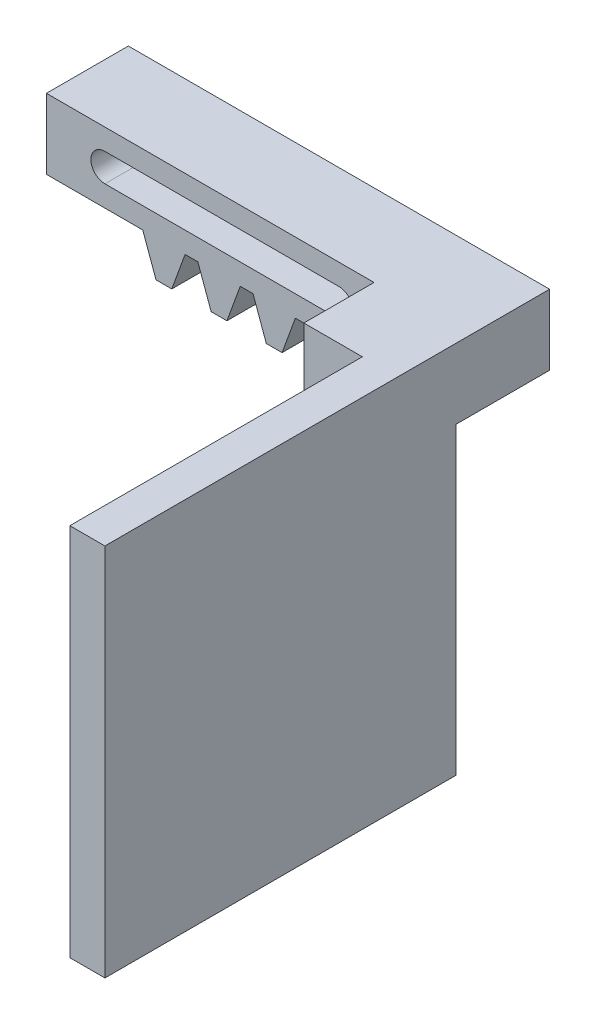
ISO-10303-21;
HEADER;
FILE_DESCRIPTION(('STEP AP214'),'2;1');
FILE_NAME('part.step','',(''),(''),'','','');
FILE_SCHEMA(('AUTOMOTIVE_DESIGN { 1 0 10303 214 1 1 1 1 }'));
ENDSEC;
DATA;
#1=APPLICATION_CONTEXT('core data for automotive mechanical design processes');
#2=APPLICATION_PROTOCOL_DEFINITION('international standard','automotive_design',2000,#1);
#3=PRODUCT_CONTEXT('',#1,'mechanical');
#4=PRODUCT('Part','Part','',(#3));
#5=PRODUCT_RELATED_PRODUCT_CATEGORY('part','',(#4));
#6=PRODUCT_DEFINITION_FORMATION('','',#4);
#7=PRODUCT_DEFINITION_CONTEXT('part definition',#1,'design');
#8=PRODUCT_DEFINITION('design','',#6,#7);
#9=PRODUCT_DEFINITION_SHAPE('','',#8);
#10=(LENGTH_UNIT() NAMED_UNIT(*) SI_UNIT(.MILLI.,.METRE.));
#11=(NAMED_UNIT(*) PLANE_ANGLE_UNIT() SI_UNIT($,.RADIAN.));
#12=(NAMED_UNIT(*) SI_UNIT($,.STERADIAN.) SOLID_ANGLE_UNIT());
#13=UNCERTAINTY_MEASURE_WITH_UNIT(LENGTH_MEASURE(1.E-05),#10,'distance_accuracy_value','');
#14=(GEOMETRIC_REPRESENTATION_CONTEXT(3) GLOBAL_UNCERTAINTY_ASSIGNED_CONTEXT((#13)) GLOBAL_UNIT_ASSIGNED_CONTEXT((#10,
#11,#12)) REPRESENTATION_CONTEXT('',''));
#15=CARTESIAN_POINT('',(0.,0.,0.));
#16=DIRECTION('',(0.,0.,1.));
#17=DIRECTION('',(1.,0.,0.));
#18=AXIS2_PLACEMENT_3D('',#15,#16,#17);
#19=CARTESIAN_POINT('',(0.,0.,20.5));
#20=DIRECTION('',(0.,0.,-1.));
#21=DIRECTION('',(-1.,0.,0.));
#22=AXIS2_PLACEMENT_3D('',#19,#20,#21);
#23=PLANE('',#22);
#24=CARTESIAN_POINT('',(-18.,16.975,20.5));
#25=DIRECTION('',(0.,0.,-1.));
#26=DIRECTION('',(-1.,0.,0.));
#27=AXIS2_PLACEMENT_3D('',#24,#25,#26);
#28=CIRCLE('',#27,1.2);
#29=CARTESIAN_POINT('',(-18.,18.175,20.5));
#30=VERTEX_POINT('',#29);
#31=CARTESIAN_POINT('',(-18.,15.775,20.5));
#32=VERTEX_POINT('',#31);
#33=EDGE_CURVE('E502',#30,#32,#28,.F.);
#34=ORIENTED_EDGE('',*,*,#33,.F.);
#35=DIRECTION('',(-1.,0.,0.));
#36=VECTOR('',#35,1.);
#37=CARTESIAN_POINT('',(0.,18.175,20.5));
#38=LINE('',#37,#36);
#39=CARTESIAN_POINT('',(2.,18.175,20.5));
#40=VERTEX_POINT('',#39);
#41=EDGE_CURVE('E500',#40,#30,#38,.T.);
#42=ORIENTED_EDGE('',*,*,#41,.F.);
#43=CARTESIAN_POINT('',(2.,16.975,20.5));
#44=DIRECTION('',(0.,0.,-1.));
#45=DIRECTION('',(-1.,0.,0.));
#46=AXIS2_PLACEMENT_3D('',#43,#44,#45);
#47=CIRCLE('',#46,1.2);
#48=CARTESIAN_POINT('',(2.,15.775,20.5));
#49=VERTEX_POINT('',#48);
#50=EDGE_CURVE('E53',#49,#40,#47,.F.);
#51=ORIENTED_EDGE('',*,*,#50,.F.);
#52=DIRECTION('',(1.,0.,0.));
#53=VECTOR('',#52,1.);
#54=CARTESIAN_POINT('',(0.,15.775,20.5));
#55=LINE('',#54,#53);
#56=EDGE_CURVE('E486',#32,#49,#55,.T.);
#57=ORIENTED_EDGE('',*,*,#56,.F.);
#58=EDGE_LOOP('',(#34,#42,#51,#57));
#59=FACE_BOUND('',#58,.T.);
#60=DIRECTION('',(0.,-1.,0.));
#61=VECTOR('',#60,1.);
#62=CARTESIAN_POINT('',(5.,19.975,20.5));
#63=LINE('',#62,#61);
#64=CARTESIAN_POINT('',(5.,19.975,20.5));
#65=VERTEX_POINT('',#64);
#66=CARTESIAN_POINT('',(5.,13.975,20.5));
#67=VERTEX_POINT('',#66);
#68=EDGE_CURVE('E456',#65,#67,#63,.T.);
#69=ORIENTED_EDGE('',*,*,#68,.F.);
#70=DIRECTION('',(-1.,0.,0.));
#71=VECTOR('',#70,1.);
#72=CARTESIAN_POINT('',(-23.,19.975,20.5));
#73=LINE('',#72,#71);
#74=CARTESIAN_POINT('',(-23.,19.975,20.5));
#75=VERTEX_POINT('',#74);
#76=EDGE_CURVE('E353',#65,#75,#73,.T.);
#77=ORIENTED_EDGE('',*,*,#76,.T.);
#78=DIRECTION('',(0.,-1.,0.));
#79=VECTOR('',#78,1.);
#80=CARTESIAN_POINT('',(-23.,13.975,20.5));
#81=LINE('',#80,#79);
#82=CARTESIAN_POINT('',(-23.,13.975,20.5));
#83=VERTEX_POINT('',#82);
#84=EDGE_CURVE('E355',#75,#83,#81,.T.);
#85=ORIENTED_EDGE('',*,*,#84,.T.);
#86=DIRECTION('',(1.,0.,0.));
#87=VECTOR('',#86,1.);
#88=CARTESIAN_POINT('',(-14.7696111304032,13.975,20.5));
#89=LINE('',#88,#87);
#90=CARTESIAN_POINT('',(-14.7696111304032,13.975,20.5));
#91=VERTEX_POINT('',#90);
#92=EDGE_CURVE('E441',#83,#91,#89,.T.);
#93=ORIENTED_EDGE('',*,*,#92,.T.);
#94=DIRECTION('',(0.342020143325669,-0.939692620785908,0.));
#95=VECTOR('',#94,1.);
#96=CARTESIAN_POINT('',(-13.6322041483213,10.85,20.5));
#97=LINE('',#96,#95);
#98=CARTESIAN_POINT('',(-13.6322041483213,10.85,20.5));
#99=VERTEX_POINT('',#98);
#100=EDGE_CURVE('E445',#91,#99,#97,.T.);
#101=ORIENTED_EDGE('',*,*,#100,.T.);
#102=DIRECTION('',(1.,0.,0.));
#103=VECTOR('',#102,1.);
#104=CARTESIAN_POINT('',(-12.2859352437945,10.85,20.5));
#105=LINE('',#104,#103);
#106=CARTESIAN_POINT('',(-12.2859352437945,10.85,20.5));
#107=VERTEX_POINT('',#106);
#108=EDGE_CURVE('E439',#99,#107,#105,.T.);
#109=ORIENTED_EDGE('',*,*,#108,.T.);
#110=DIRECTION('',(0.342020143325669,0.939692620785908,0.));
#111=VECTOR('',#110,1.);
#112=CARTESIAN_POINT('',(-11.1485282617126,13.975,20.5));
#113=LINE('',#112,#111);
#114=CARTESIAN_POINT('',(-11.1485282617126,13.975,20.5));
#115=VERTEX_POINT('',#114);
#116=EDGE_CURVE('E437',#107,#115,#113,.T.);
#117=ORIENTED_EDGE('',*,*,#116,.T.);
#118=DIRECTION('',(1.,0.,0.));
#119=VECTOR('',#118,1.);
#120=CARTESIAN_POINT('',(-10.0572221500185,13.975,20.5));
#121=LINE('',#120,#119);
#122=CARTESIAN_POINT('',(-10.0572221500185,13.975,20.5));
#123=VERTEX_POINT('',#122);
#124=EDGE_CURVE('E436',#115,#123,#121,.T.);
#125=ORIENTED_EDGE('',*,*,#124,.T.);
#126=DIRECTION('',(0.342020143325669,-0.939692620785908,0.));
#127=VECTOR('',#126,1.);
#128=CARTESIAN_POINT('',(-8.91981516793663,10.85,20.5));
#129=LINE('',#128,#127);
#130=CARTESIAN_POINT('',(-8.91981516793663,10.85,20.5));
#131=VERTEX_POINT('',#130);
#132=EDGE_CURVE('E432',#123,#131,#129,.T.);
#133=ORIENTED_EDGE('',*,*,#132,.T.);
#134=DIRECTION('',(1.,0.,0.));
#135=VECTOR('',#134,1.);
#136=CARTESIAN_POINT('',(-7.57354626340979,10.85,20.5));
#137=LINE('',#136,#135);
#138=CARTESIAN_POINT('',(-7.57354626340979,10.85,20.5));
#139=VERTEX_POINT('',#138);
#140=EDGE_CURVE('E435',#131,#139,#137,.T.);
#141=ORIENTED_EDGE('',*,*,#140,.T.);
#142=DIRECTION('',(0.342020143325669,0.939692620785909,0.));
#143=VECTOR('',#142,1.);
#144=CARTESIAN_POINT('',(-6.43613928132791,13.975,20.5));
#145=LINE('',#144,#143);
#146=CARTESIAN_POINT('',(-6.43613928132791,13.975,20.5));
#147=VERTEX_POINT('',#146);
#148=EDGE_CURVE('E429',#139,#147,#145,.T.);
#149=ORIENTED_EDGE('',*,*,#148,.T.);
#150=DIRECTION('',(1.,0.,0.));
#151=VECTOR('',#150,1.);
#152=CARTESIAN_POINT('',(-5.34483316963382,13.975,20.5));
#153=LINE('',#152,#151);
#154=CARTESIAN_POINT('',(-5.34483316963382,13.975,20.5));
#155=VERTEX_POINT('',#154);
#156=EDGE_CURVE('E428',#147,#155,#153,.T.);
#157=ORIENTED_EDGE('',*,*,#156,.T.);
#158=DIRECTION('',(0.342020143325669,-0.939692620785909,0.));
#159=VECTOR('',#158,1.);
#160=CARTESIAN_POINT('',(-4.20742618755194,10.85,20.5));
#161=LINE('',#160,#159);
#162=CARTESIAN_POINT('',(-4.20742618755194,10.85,20.5));
#163=VERTEX_POINT('',#162);
#164=EDGE_CURVE('E426',#155,#163,#161,.T.);
#165=ORIENTED_EDGE('',*,*,#164,.T.);
#166=DIRECTION('',(1.,0.,0.));
#167=VECTOR('',#166,1.);
#168=CARTESIAN_POINT('',(-2.8611572830251,10.85,20.5));
#169=LINE('',#168,#167);
#170=CARTESIAN_POINT('',(-2.8611572830251,10.85,20.5));
#171=VERTEX_POINT('',#170);
#172=EDGE_CURVE('E424',#163,#171,#169,.T.);
#173=ORIENTED_EDGE('',*,*,#172,.T.);
#174=DIRECTION('',(0.342020143325669,0.939692620785909,0.));
#175=VECTOR('',#174,1.);
#176=CARTESIAN_POINT('',(-1.72375030094322,13.975,20.5));
#177=LINE('',#176,#175);
#178=CARTESIAN_POINT('',(-1.72375030094322,13.975,20.5));
#179=VERTEX_POINT('',#178);
#180=EDGE_CURVE('E425',#171,#179,#177,.T.);
#181=ORIENTED_EDGE('',*,*,#180,.T.);
#182=DIRECTION('',(1.,0.,0.));
#183=VECTOR('',#182,1.);
#184=CARTESIAN_POINT('',(-0.632444189249129,13.975,20.5));
#185=LINE('',#184,#183);
#186=CARTESIAN_POINT('',(-0.632444189249129,13.975,20.5));
#187=VERTEX_POINT('',#186);
#188=EDGE_CURVE('E419',#179,#187,#185,.T.);
#189=ORIENTED_EDGE('',*,*,#188,.T.);
#190=DIRECTION('',(0.342020143325669,-0.939692620785909,0.));
#191=VECTOR('',#190,1.);
#192=CARTESIAN_POINT('',(0.504962792832753,10.85,20.5));
#193=LINE('',#192,#191);
#194=CARTESIAN_POINT('',(0.504962792832753,10.85,20.5));
#195=VERTEX_POINT('',#194);
#196=EDGE_CURVE('E416',#187,#195,#193,.T.);
#197=ORIENTED_EDGE('',*,*,#196,.T.);
#198=DIRECTION('',(1.,0.,0.));
#199=VECTOR('',#198,1.);
#200=CARTESIAN_POINT('',(1.85123169735959,10.85,20.5));
#201=LINE('',#200,#199);
#202=CARTESIAN_POINT('',(1.85123169735959,10.85,20.5));
#203=VERTEX_POINT('',#202);
#204=EDGE_CURVE('E418',#195,#203,#201,.T.);
#205=ORIENTED_EDGE('',*,*,#204,.T.);
#206=DIRECTION('',(0.342020143325669,0.939692620785909,0.));
#207=VECTOR('',#206,1.);
#208=CARTESIAN_POINT('',(2.98863867944147,13.975,20.5));
#209=LINE('',#208,#207);
#210=CARTESIAN_POINT('',(2.98863867944147,13.975,20.5));
#211=VERTEX_POINT('',#210);
#212=EDGE_CURVE('E412',#203,#211,#209,.T.);
#213=ORIENTED_EDGE('',*,*,#212,.T.);
#214=DIRECTION('',(1.,0.,0.));
#215=VECTOR('',#214,1.);
#216=CARTESIAN_POINT('',(4.07994479113556,13.975,20.5));
#217=LINE('',#216,#215);
#218=CARTESIAN_POINT('',(4.07994479113556,13.975,20.5));
#219=VERTEX_POINT('',#218);
#220=EDGE_CURVE('E415',#211,#219,#217,.T.);
#221=ORIENTED_EDGE('',*,*,#220,.T.);
#222=DIRECTION('',(0.342020143325669,-0.939692620785909,0.));
#223=VECTOR('',#222,1.);
#224=CARTESIAN_POINT('',(5.21735177321744,10.85,20.5));
#225=LINE('',#224,#223);
#226=CARTESIAN_POINT('',(5.21735177321744,10.85,20.5));
#227=VERTEX_POINT('',#226);
#228=EDGE_CURVE('E406',#219,#227,#225,.T.);
#229=ORIENTED_EDGE('',*,*,#228,.T.);
#230=DIRECTION('',(1.,0.,0.));
#231=VECTOR('',#230,1.);
#232=CARTESIAN_POINT('',(6.56362067774428,10.85,20.5));
#233=LINE('',#232,#231);
#234=CARTESIAN_POINT('',(6.56362067774428,10.85,20.5));
#235=VERTEX_POINT('',#234);
#236=EDGE_CURVE('E407',#227,#235,#233,.T.);
#237=ORIENTED_EDGE('',*,*,#236,.T.);
#238=DIRECTION('',(0.342020143325669,0.939692620785909,0.));
#239=VECTOR('',#238,1.);
#240=CARTESIAN_POINT('',(7.70102765982616,13.975,20.5));
#241=LINE('',#240,#239);
#242=CARTESIAN_POINT('',(7.70102765982616,13.975,20.5));
#243=VERTEX_POINT('',#242);
#244=EDGE_CURVE('E408',#235,#243,#241,.T.);
#245=ORIENTED_EDGE('',*,*,#244,.T.);
#246=DIRECTION('',(1.,0.,0.));
#247=VECTOR('',#246,1.);
#248=CARTESIAN_POINT('',(5.,13.975,20.5));
#249=LINE('',#248,#247);
#250=EDGE_CURVE('E452',#67,#243,#249,.T.);
#251=ORIENTED_EDGE('',*,*,#250,.F.);
#252=EDGE_LOOP('',(#69,#77,#85,#93,#101,#109,#117,#125,#133,#141,#149,#157,#165,#173,#181,#189,
#197,#205,#213,#221,#229,#237,#245,#251));
#253=FACE_BOUND('',#252,.T.);
#254=ADVANCED_FACE('F39',(#59,#253),#23,.F.);
#255=CARTESIAN_POINT('',(0.,0.,13.5));
#256=DIRECTION('',(0.,0.,-1.));
#257=DIRECTION('',(-1.,0.,0.));
#258=AXIS2_PLACEMENT_3D('',#255,#256,#257);
#259=PLANE('',#258);
#260=DIRECTION('',(0.,-1.,0.));
#261=VECTOR('',#260,1.);
#262=CARTESIAN_POINT('',(-23.,13.975,13.5));
#263=LINE('',#262,#261);
#264=CARTESIAN_POINT('',(-23.,19.975,13.5));
#265=VERTEX_POINT('',#264);
#266=CARTESIAN_POINT('',(-23.,13.975,13.5));
#267=VERTEX_POINT('',#266);
#268=EDGE_CURVE('E402',#265,#267,#263,.T.);
#269=ORIENTED_EDGE('',*,*,#268,.F.);
#270=DIRECTION('',(-1.,0.,0.));
#271=VECTOR('',#270,1.);
#272=CARTESIAN_POINT('',(-23.,19.975,13.5));
#273=LINE('',#272,#271);
#274=CARTESIAN_POINT('',(13.,19.975,13.5));
#275=VERTEX_POINT('',#274);
#276=EDGE_CURVE('E354',#275,#265,#273,.T.);
#277=ORIENTED_EDGE('',*,*,#276,.F.);
#278=DIRECTION('',(0.,1.,0.));
#279=VECTOR('',#278,1.);
#280=CARTESIAN_POINT('',(13.,19.975,13.5));
#281=LINE('',#280,#279);
#282=CARTESIAN_POINT('',(13.,13.975,13.5));
#283=VERTEX_POINT('',#282);
#284=EDGE_CURVE('E351',#283,#275,#281,.T.);
#285=ORIENTED_EDGE('',*,*,#284,.F.);
#286=DIRECTION('',(1.,0.,0.));
#287=VECTOR('',#286,1.);
#288=CARTESIAN_POINT('',(13.,13.975,13.5));
#289=LINE('',#288,#287);
#290=CARTESIAN_POINT('',(7.70102765982616,13.975,13.5));
#291=VERTEX_POINT('',#290);
#292=EDGE_CURVE('E356',#291,#283,#289,.T.);
#293=ORIENTED_EDGE('',*,*,#292,.F.);
#294=DIRECTION('',(0.342020143325669,0.939692620785909,0.));
#295=VECTOR('',#294,1.);
#296=CARTESIAN_POINT('',(7.70102765982616,13.975,13.5));
#297=LINE('',#296,#295);
#298=CARTESIAN_POINT('',(6.56362067774428,10.85,13.5));
#299=VERTEX_POINT('',#298);
#300=EDGE_CURVE('E363',#299,#291,#297,.T.);
#301=ORIENTED_EDGE('',*,*,#300,.F.);
#302=DIRECTION('',(1.,0.,0.));
#303=VECTOR('',#302,1.);
#304=CARTESIAN_POINT('',(6.56362067774428,10.85,13.5));
#305=LINE('',#304,#303);
#306=CARTESIAN_POINT('',(5.21735177321744,10.85,13.5));
#307=VERTEX_POINT('',#306);
#308=EDGE_CURVE('E361',#307,#299,#305,.T.);
#309=ORIENTED_EDGE('',*,*,#308,.F.);
#310=DIRECTION('',(0.342020143325669,-0.939692620785909,0.));
#311=VECTOR('',#310,1.);
#312=CARTESIAN_POINT('',(5.21735177321744,10.85,13.5));
#313=LINE('',#312,#311);
#314=CARTESIAN_POINT('',(4.07994479113556,13.975,13.5));
#315=VERTEX_POINT('',#314);
#316=EDGE_CURVE('E364',#315,#307,#313,.T.);
#317=ORIENTED_EDGE('',*,*,#316,.F.);
#318=DIRECTION('',(1.,0.,0.));
#319=VECTOR('',#318,1.);
#320=CARTESIAN_POINT('',(4.07994479113556,13.975,13.5));
#321=LINE('',#320,#319);
#322=CARTESIAN_POINT('',(2.98863867944147,13.975,13.5));
#323=VERTEX_POINT('',#322);
#324=EDGE_CURVE('E370',#323,#315,#321,.T.);
#325=ORIENTED_EDGE('',*,*,#324,.F.);
#326=DIRECTION('',(0.342020143325669,0.939692620785909,0.));
#327=VECTOR('',#326,1.);
#328=CARTESIAN_POINT('',(2.98863867944147,13.975,13.5));
#329=LINE('',#328,#327);
#330=CARTESIAN_POINT('',(1.85123169735959,10.85,13.5));
#331=VERTEX_POINT('',#330);
#332=EDGE_CURVE('E369',#331,#323,#329,.T.);
#333=ORIENTED_EDGE('',*,*,#332,.F.);
#334=DIRECTION('',(1.,0.,0.));
#335=VECTOR('',#334,1.);
#336=CARTESIAN_POINT('',(1.85123169735959,10.85,13.5));
#337=LINE('',#336,#335);
#338=CARTESIAN_POINT('',(0.504962792832753,10.85,13.5));
#339=VERTEX_POINT('',#338);
#340=EDGE_CURVE('E371',#339,#331,#337,.T.);
#341=ORIENTED_EDGE('',*,*,#340,.F.);
#342=DIRECTION('',(0.342020143325669,-0.939692620785909,0.));
#343=VECTOR('',#342,1.);
#344=CARTESIAN_POINT('',(0.504962792832753,10.85,13.5));
#345=LINE('',#344,#343);
#346=CARTESIAN_POINT('',(-0.632444189249129,13.975,13.5));
#347=VERTEX_POINT('',#346);
#348=EDGE_CURVE('E373',#347,#339,#345,.T.);
#349=ORIENTED_EDGE('',*,*,#348,.F.);
#350=DIRECTION('',(1.,0.,0.));
#351=VECTOR('',#350,1.);
#352=CARTESIAN_POINT('',(-0.632444189249129,13.975,13.5));
#353=LINE('',#352,#351);
#354=CARTESIAN_POINT('',(-1.72375030094322,13.975,13.5));
#355=VERTEX_POINT('',#354);
#356=EDGE_CURVE('E374',#355,#347,#353,.T.);
#357=ORIENTED_EDGE('',*,*,#356,.F.);
#358=DIRECTION('',(0.342020143325669,0.939692620785909,0.));
#359=VECTOR('',#358,1.);
#360=CARTESIAN_POINT('',(-1.72375030094322,13.975,13.5));
#361=LINE('',#360,#359);
#362=CARTESIAN_POINT('',(-2.8611572830251,10.85,13.5));
#363=VERTEX_POINT('',#362);
#364=EDGE_CURVE('E380',#363,#355,#361,.T.);
#365=ORIENTED_EDGE('',*,*,#364,.F.);
#366=DIRECTION('',(1.,0.,0.));
#367=VECTOR('',#366,1.);
#368=CARTESIAN_POINT('',(-2.8611572830251,10.85,13.5));
#369=LINE('',#368,#367);
#370=CARTESIAN_POINT('',(-4.20742618755194,10.85,13.5));
#371=VERTEX_POINT('',#370);
#372=EDGE_CURVE('E377',#371,#363,#369,.T.);
#373=ORIENTED_EDGE('',*,*,#372,.F.);
#374=DIRECTION('',(0.342020143325669,-0.939692620785909,0.));
#375=VECTOR('',#374,1.);
#376=CARTESIAN_POINT('',(-4.20742618755194,10.85,13.5));
#377=LINE('',#376,#375);
#378=CARTESIAN_POINT('',(-5.34483316963382,13.975,13.5));
#379=VERTEX_POINT('',#378);
#380=EDGE_CURVE('E381',#379,#371,#377,.T.);
#381=ORIENTED_EDGE('',*,*,#380,.F.);
#382=DIRECTION('',(1.,0.,0.));
#383=VECTOR('',#382,1.);
#384=CARTESIAN_POINT('',(-5.34483316963382,13.975,13.5));
#385=LINE('',#384,#383);
#386=CARTESIAN_POINT('',(-6.43613928132791,13.975,13.5));
#387=VERTEX_POINT('',#386);
#388=EDGE_CURVE('E382',#387,#379,#385,.T.);
#389=ORIENTED_EDGE('',*,*,#388,.F.);
#390=DIRECTION('',(0.342020143325669,0.939692620785909,0.));
#391=VECTOR('',#390,1.);
#392=CARTESIAN_POINT('',(-6.43613928132791,13.975,13.5));
#393=LINE('',#392,#391);
#394=CARTESIAN_POINT('',(-7.57354626340979,10.85,13.5));
#395=VERTEX_POINT('',#394);
#396=EDGE_CURVE('E384',#395,#387,#393,.T.);
#397=ORIENTED_EDGE('',*,*,#396,.F.);
#398=DIRECTION('',(1.,0.,0.));
#399=VECTOR('',#398,1.);
#400=CARTESIAN_POINT('',(-7.57354626340979,10.85,13.5));
#401=LINE('',#400,#399);
#402=CARTESIAN_POINT('',(-8.91981516793663,10.85,13.5));
#403=VERTEX_POINT('',#402);
#404=EDGE_CURVE('E390',#403,#395,#401,.T.);
#405=ORIENTED_EDGE('',*,*,#404,.F.);
#406=DIRECTION('',(0.342020143325669,-0.939692620785908,0.));
#407=VECTOR('',#406,1.);
#408=CARTESIAN_POINT('',(-8.91981516793663,10.85,13.5));
#409=LINE('',#408,#407);
#410=CARTESIAN_POINT('',(-10.0572221500185,13.975,13.5));
#411=VERTEX_POINT('',#410);
#412=EDGE_CURVE('E386',#411,#403,#409,.T.);
#413=ORIENTED_EDGE('',*,*,#412,.F.);
#414=DIRECTION('',(1.,0.,0.));
#415=VECTOR('',#414,1.);
#416=CARTESIAN_POINT('',(-10.0572221500185,13.975,13.5));
#417=LINE('',#416,#415);
#418=CARTESIAN_POINT('',(-11.1485282617126,13.975,13.5));
#419=VERTEX_POINT('',#418);
#420=EDGE_CURVE('E393',#419,#411,#417,.T.);
#421=ORIENTED_EDGE('',*,*,#420,.F.);
#422=DIRECTION('',(0.342020143325669,0.939692620785908,0.));
#423=VECTOR('',#422,1.);
#424=CARTESIAN_POINT('',(-11.1485282617126,13.975,13.5));
#425=LINE('',#424,#423);
#426=CARTESIAN_POINT('',(-12.2859352437945,10.85,13.5));
#427=VERTEX_POINT('',#426);
#428=EDGE_CURVE('E392',#427,#419,#425,.T.);
#429=ORIENTED_EDGE('',*,*,#428,.F.);
#430=DIRECTION('',(1.,0.,0.));
#431=VECTOR('',#430,1.);
#432=CARTESIAN_POINT('',(-12.2859352437945,10.85,13.5));
#433=LINE('',#432,#431);
#434=CARTESIAN_POINT('',(-13.6322041483213,10.85,13.5));
#435=VERTEX_POINT('',#434);
#436=EDGE_CURVE('E391',#435,#427,#433,.T.);
#437=ORIENTED_EDGE('',*,*,#436,.F.);
#438=DIRECTION('',(0.342020143325669,-0.939692620785908,0.));
#439=VECTOR('',#438,1.);
#440=CARTESIAN_POINT('',(-13.6322041483213,10.85,13.5));
#441=LINE('',#440,#439);
#442=CARTESIAN_POINT('',(-14.7696111304032,13.975,13.5));
#443=VERTEX_POINT('',#442);
#444=EDGE_CURVE('E400',#443,#435,#441,.T.);
#445=ORIENTED_EDGE('',*,*,#444,.F.);
#446=DIRECTION('',(1.,0.,0.));
#447=VECTOR('',#446,1.);
#448=CARTESIAN_POINT('',(-14.7696111304032,13.975,13.5));
#449=LINE('',#448,#447);
#450=EDGE_CURVE('E397',#267,#443,#449,.T.);
#451=ORIENTED_EDGE('',*,*,#450,.F.);
#452=EDGE_LOOP('',(#269,#277,#285,#293,#301,#309,#317,#325,#333,#341,#349,#357,#365,#373,#381,
#389,#397,#405,#413,#421,#429,#437,#445,#451));
#453=FACE_BOUND('',#452,.T.);
#454=DIRECTION('',(-1.,0.,0.));
#455=VECTOR('',#454,1.);
#456=CARTESIAN_POINT('',(0.,18.175,13.5));
#457=LINE('',#456,#455);
#458=CARTESIAN_POINT('',(2.,18.175,13.5));
#459=VERTEX_POINT('',#458);
#460=CARTESIAN_POINT('',(-18.,18.175,13.5));
#461=VERTEX_POINT('',#460);
#462=EDGE_CURVE('E50',#459,#461,#457,.T.);
#463=ORIENTED_EDGE('',*,*,#462,.T.);
#464=CARTESIAN_POINT('',(-18.,16.975,13.5));
#465=DIRECTION('',(0.,0.,-1.));
#466=DIRECTION('',(-1.,0.,0.));
#467=AXIS2_PLACEMENT_3D('',#464,#465,#466);
#468=CIRCLE('',#467,1.2);
#469=CARTESIAN_POINT('',(-18.,15.775,13.5));
#470=VERTEX_POINT('',#469);
#471=EDGE_CURVE('E64',#461,#470,#468,.F.);
#472=ORIENTED_EDGE('',*,*,#471,.T.);
#473=DIRECTION('',(1.,0.,0.));
#474=VECTOR('',#473,1.);
#475=CARTESIAN_POINT('',(0.,15.775,13.5));
#476=LINE('',#475,#474);
#477=CARTESIAN_POINT('',(2.,15.775,13.5));
#478=VERTEX_POINT('',#477);
#479=EDGE_CURVE('E11',#470,#478,#476,.T.);
#480=ORIENTED_EDGE('',*,*,#479,.T.);
#481=CARTESIAN_POINT('',(2.,16.975,13.5));
#482=DIRECTION('',(0.,0.,-1.));
#483=DIRECTION('',(-1.,0.,0.));
#484=AXIS2_PLACEMENT_3D('',#481,#482,#483);
#485=CIRCLE('',#484,1.2);
#486=EDGE_CURVE('E257',#478,#459,#485,.F.);
#487=ORIENTED_EDGE('',*,*,#486,.T.);
#488=EDGE_LOOP('',(#463,#472,#480,#487));
#489=FACE_BOUND('',#488,.T.);
#490=ADVANCED_FACE('F271',(#453,#489),#259,.T.);
#491=CARTESIAN_POINT('',(13.,13.975,20.5));
#492=DIRECTION('',(0.,1.,0.));
#493=DIRECTION('',(0.,0.,1.));
#494=AXIS2_PLACEMENT_3D('',#491,#492,#493);
#495=PLANE('',#494);
#496=DIRECTION('',(0.,0.,-1.));
#497=VECTOR('',#496,1.);
#498=CARTESIAN_POINT('',(10.,13.975,20.5));
#499=LINE('',#498,#497);
#500=CARTESIAN_POINT('',(10.,13.975,26.5));
#501=VERTEX_POINT('',#500);
#502=CARTESIAN_POINT('',(10.,13.975,21.5));
#503=VERTEX_POINT('',#502);
#504=EDGE_CURVE('E463',#501,#503,#499,.T.);
#505=ORIENTED_EDGE('',*,*,#504,.F.);
#506=DIRECTION('',(1.,0.,0.));
#507=VECTOR('',#506,1.);
#508=CARTESIAN_POINT('',(5.,13.975,26.5));
#509=LINE('',#508,#507);
#510=CARTESIAN_POINT('',(5.,13.975,26.5));
#511=VERTEX_POINT('',#510);
#512=EDGE_CURVE('E462',#511,#501,#509,.T.);
#513=ORIENTED_EDGE('',*,*,#512,.F.);
#514=DIRECTION('',(0.,0.,-1.));
#515=VECTOR('',#514,1.);
#516=CARTESIAN_POINT('',(5.,13.975,26.5));
#517=LINE('',#516,#515);
#518=EDGE_CURVE('E404',#511,#67,#517,.T.);
#519=ORIENTED_EDGE('',*,*,#518,.T.);
#520=ORIENTED_EDGE('',*,*,#250,.T.);
#521=DIRECTION('',(0.,0.,-1.));
#522=VECTOR('',#521,1.);
#523=CARTESIAN_POINT('',(7.70102765982616,13.975,20.5));
#524=LINE('',#523,#522);
#525=EDGE_CURVE('E343',#243,#291,#524,.T.);
#526=ORIENTED_EDGE('',*,*,#525,.T.);
#527=ORIENTED_EDGE('',*,*,#292,.T.);
#528=DIRECTION('',(0.,0.,-1.));
#529=VECTOR('',#528,1.);
#530=CARTESIAN_POINT('',(13.,13.975,20.5));
#531=LINE('',#530,#529);
#532=CARTESIAN_POINT('',(13.,13.975,21.5));
#533=VERTEX_POINT('',#532);
#534=EDGE_CURVE('E342',#533,#283,#531,.T.);
#535=ORIENTED_EDGE('',*,*,#534,.F.);
#536=DIRECTION('',(1.,0.,0.));
#537=VECTOR('',#536,1.);
#538=CARTESIAN_POINT('',(13.,13.975,21.5));
#539=LINE('',#538,#537);
#540=EDGE_CURVE('E274',#503,#533,#539,.T.);
#541=ORIENTED_EDGE('',*,*,#540,.F.);
#542=EDGE_LOOP('',(#505,#513,#519,#520,#526,#527,#535,#541));
#543=FACE_BOUND('',#542,.T.);
#544=ADVANCED_FACE('F528',(#543),#495,.F.);
#545=CARTESIAN_POINT('',(0.,0.,26.5));
#546=DIRECTION('',(0.,0.,1.));
#547=DIRECTION('',(1.,0.,0.));
#548=AXIS2_PLACEMENT_3D('',#545,#546,#547);
#549=PLANE('',#548);
#550=ORIENTED_EDGE('',*,*,#512,.T.);
#551=DIRECTION('',(0.,1.,0.));
#552=VECTOR('',#551,1.);
#553=CARTESIAN_POINT('',(10.,0.,26.5));
#554=LINE('',#553,#552);
#555=CARTESIAN_POINT('',(10.,19.975,26.5));
#556=VERTEX_POINT('',#555);
#557=EDGE_CURVE('E277',#501,#556,#554,.T.);
#558=ORIENTED_EDGE('',*,*,#557,.T.);
#559=DIRECTION('',(-1.,0.,0.));
#560=VECTOR('',#559,1.);
#561=CARTESIAN_POINT('',(13.,19.975,26.5));
#562=LINE('',#561,#560);
#563=CARTESIAN_POINT('',(5.,19.975,26.5));
#564=VERTEX_POINT('',#563);
#565=EDGE_CURVE('E451',#556,#564,#562,.T.);
#566=ORIENTED_EDGE('',*,*,#565,.T.);
#567=DIRECTION('',(0.,-1.,0.));
#568=VECTOR('',#567,1.);
#569=CARTESIAN_POINT('',(5.,19.975,26.5));
#570=LINE('',#569,#568);
#571=EDGE_CURVE('E460',#564,#511,#570,.T.);
#572=ORIENTED_EDGE('',*,*,#571,.T.);
#573=EDGE_LOOP('',(#550,#558,#566,#572));
#574=FACE_BOUND('',#573,.T.);
#575=ADVANCED_FACE('F542',(#574),#549,.T.);
#576=CARTESIAN_POINT('',(-23.,13.975,20.5));
#577=DIRECTION('',(1.,0.,0.));
#578=DIRECTION('',(0.,0.,-1.));
#579=AXIS2_PLACEMENT_3D('',#576,#577,#578);
#580=PLANE('',#579);
#581=ORIENTED_EDGE('',*,*,#268,.T.);
#582=DIRECTION('',(0.,0.,-1.));
#583=VECTOR('',#582,1.);
#584=CARTESIAN_POINT('',(-23.,13.975,20.5));
#585=LINE('',#584,#583);
#586=EDGE_CURVE('E283',#83,#267,#585,.T.);
#587=ORIENTED_EDGE('',*,*,#586,.F.);
#588=ORIENTED_EDGE('',*,*,#84,.F.);
#589=DIRECTION('',(0.,0.,-1.));
#590=VECTOR('',#589,1.);
#591=CARTESIAN_POINT('',(-23.,19.975,20.5));
#592=LINE('',#591,#590);
#593=EDGE_CURVE('E346',#75,#265,#592,.T.);
#594=ORIENTED_EDGE('',*,*,#593,.T.);
#595=EDGE_LOOP('',(#581,#587,#588,#594));
#596=FACE_BOUND('',#595,.T.);
#597=ADVANCED_FACE('F41',(#596),#580,.F.);
#598=CARTESIAN_POINT('',(-14.7696111304032,13.975,20.5));
#599=DIRECTION('',(0.,1.,0.));
#600=DIRECTION('',(0.,0.,1.));
#601=AXIS2_PLACEMENT_3D('',#598,#599,#600);
#602=PLANE('',#601);
#603=ORIENTED_EDGE('',*,*,#450,.T.);
#604=DIRECTION('',(0.,0.,-1.));
#605=VECTOR('',#604,1.);
#606=CARTESIAN_POINT('',(-14.7696111304032,13.975,20.5));
#607=LINE('',#606,#605);
#608=EDGE_CURVE('E285',#91,#443,#607,.T.);
#609=ORIENTED_EDGE('',*,*,#608,.F.);
#610=ORIENTED_EDGE('',*,*,#92,.F.);
#611=ORIENTED_EDGE('',*,*,#586,.T.);
#612=EDGE_LOOP('',(#603,#609,#610,#611));
#613=FACE_BOUND('',#612,.T.);
#614=ADVANCED_FACE('F617',(#613),#602,.F.);
#615=CARTESIAN_POINT('',(-13.6322041483213,10.85,20.5));
#616=DIRECTION('',(0.939692620785908,0.342020143325669,0.));
#617=DIRECTION('',(-0.342020143325669,0.939692620785908,0.));
#618=AXIS2_PLACEMENT_3D('',#615,#616,#617);
#619=PLANE('',#618);
#620=ORIENTED_EDGE('',*,*,#444,.T.);
#621=DIRECTION('',(0.,0.,-1.));
#622=VECTOR('',#621,1.);
#623=CARTESIAN_POINT('',(-13.6322041483213,10.85,20.5));
#624=LINE('',#623,#622);
#625=EDGE_CURVE('E290',#99,#435,#624,.T.);
#626=ORIENTED_EDGE('',*,*,#625,.F.);
#627=ORIENTED_EDGE('',*,*,#100,.F.);
#628=ORIENTED_EDGE('',*,*,#608,.T.);
#629=EDGE_LOOP('',(#620,#626,#627,#628));
#630=FACE_BOUND('',#629,.T.);
#631=ADVANCED_FACE('F618',(#630),#619,.F.);
#632=CARTESIAN_POINT('',(-12.2859352437945,10.85,20.5));
#633=DIRECTION('',(0.,1.,0.));
#634=DIRECTION('',(0.,0.,1.));
#635=AXIS2_PLACEMENT_3D('',#632,#633,#634);
#636=PLANE('',#635);
#637=ORIENTED_EDGE('',*,*,#436,.T.);
#638=DIRECTION('',(0.,0.,-1.));
#639=VECTOR('',#638,1.);
#640=CARTESIAN_POINT('',(-12.2859352437945,10.85,20.5));
#641=LINE('',#640,#639);
#642=EDGE_CURVE('E289',#107,#427,#641,.T.);
#643=ORIENTED_EDGE('',*,*,#642,.F.);
#644=ORIENTED_EDGE('',*,*,#108,.F.);
#645=ORIENTED_EDGE('',*,*,#625,.T.);
#646=EDGE_LOOP('',(#637,#643,#644,#645));
#647=FACE_BOUND('',#646,.T.);
#648=ADVANCED_FACE('F614',(#647),#636,.F.);
#649=CARTESIAN_POINT('',(-11.1485282617126,13.975,20.5));
#650=DIRECTION('',(-0.939692620785908,0.342020143325669,0.));
#651=DIRECTION('',(-0.342020143325669,-0.939692620785908,0.));
#652=AXIS2_PLACEMENT_3D('',#649,#650,#651);
#653=PLANE('',#652);
#654=ORIENTED_EDGE('',*,*,#428,.T.);
#655=DIRECTION('',(0.,0.,-1.));
#656=VECTOR('',#655,1.);
#657=CARTESIAN_POINT('',(-11.1485282617126,13.975,20.5));
#658=LINE('',#657,#656);
#659=EDGE_CURVE('E291',#115,#419,#658,.T.);
#660=ORIENTED_EDGE('',*,*,#659,.F.);
#661=ORIENTED_EDGE('',*,*,#116,.F.);
#662=ORIENTED_EDGE('',*,*,#642,.T.);
#663=EDGE_LOOP('',(#654,#660,#661,#662));
#664=FACE_BOUND('',#663,.T.);
#665=ADVANCED_FACE('F609',(#664),#653,.F.);
#666=CARTESIAN_POINT('',(-10.0572221500185,13.975,20.5));
#667=DIRECTION('',(0.,1.,0.));
#668=DIRECTION('',(0.,0.,1.));
#669=AXIS2_PLACEMENT_3D('',#666,#667,#668);
#670=PLANE('',#669);
#671=ORIENTED_EDGE('',*,*,#420,.T.);
#672=DIRECTION('',(0.,0.,-1.));
#673=VECTOR('',#672,1.);
#674=CARTESIAN_POINT('',(-10.0572221500185,13.975,20.5));
#675=LINE('',#674,#673);
#676=EDGE_CURVE('E298',#123,#411,#675,.T.);
#677=ORIENTED_EDGE('',*,*,#676,.F.);
#678=ORIENTED_EDGE('',*,*,#124,.F.);
#679=ORIENTED_EDGE('',*,*,#659,.T.);
#680=EDGE_LOOP('',(#671,#677,#678,#679));
#681=FACE_BOUND('',#680,.T.);
#682=ADVANCED_FACE('F603',(#681),#670,.F.);
#683=CARTESIAN_POINT('',(-8.91981516793663,10.85,20.5));
#684=DIRECTION('',(0.939692620785908,0.342020143325669,0.));
#685=DIRECTION('',(-0.342020143325669,0.939692620785908,0.));
#686=AXIS2_PLACEMENT_3D('',#683,#684,#685);
#687=PLANE('',#686);
#688=ORIENTED_EDGE('',*,*,#412,.T.);
#689=DIRECTION('',(0.,0.,-1.));
#690=VECTOR('',#689,1.);
#691=CARTESIAN_POINT('',(-8.91981516793663,10.85,20.5));
#692=LINE('',#691,#690);
#693=EDGE_CURVE('E300',#131,#403,#692,.T.);
#694=ORIENTED_EDGE('',*,*,#693,.F.);
#695=ORIENTED_EDGE('',*,*,#132,.F.);
#696=ORIENTED_EDGE('',*,*,#676,.T.);
#697=EDGE_LOOP('',(#688,#694,#695,#696));
#698=FACE_BOUND('',#697,.T.);
#699=ADVANCED_FACE('F599',(#698),#687,.F.);
#700=CARTESIAN_POINT('',(-7.57354626340979,10.85,20.5));
#701=DIRECTION('',(0.,1.,0.));
#702=DIRECTION('',(0.,0.,1.));
#703=AXIS2_PLACEMENT_3D('',#700,#701,#702);
#704=PLANE('',#703);
#705=ORIENTED_EDGE('',*,*,#404,.T.);
#706=DIRECTION('',(0.,0.,-1.));
#707=VECTOR('',#706,1.);
#708=CARTESIAN_POINT('',(-7.57354626340979,10.85,20.5));
#709=LINE('',#708,#707);
#710=EDGE_CURVE('E305',#139,#395,#709,.T.);
#711=ORIENTED_EDGE('',*,*,#710,.F.);
#712=ORIENTED_EDGE('',*,*,#140,.F.);
#713=ORIENTED_EDGE('',*,*,#693,.T.);
#714=EDGE_LOOP('',(#705,#711,#712,#713));
#715=FACE_BOUND('',#714,.T.);
#716=ADVANCED_FACE('F596',(#715),#704,.F.);
#717=CARTESIAN_POINT('',(-6.43613928132791,13.975,20.5));
#718=DIRECTION('',(-0.939692620785908,0.342020143325669,0.));
#719=DIRECTION('',(-0.342020143325669,-0.939692620785909,0.));
#720=AXIS2_PLACEMENT_3D('',#717,#718,#719);
#721=PLANE('',#720);
#722=ORIENTED_EDGE('',*,*,#396,.T.);
#723=DIRECTION('',(0.,0.,-1.));
#724=VECTOR('',#723,1.);
#725=CARTESIAN_POINT('',(-6.43613928132791,13.975,20.5));
#726=LINE('',#725,#724);
#727=EDGE_CURVE('E304',#147,#387,#726,.T.);
#728=ORIENTED_EDGE('',*,*,#727,.F.);
#729=ORIENTED_EDGE('',*,*,#148,.F.);
#730=ORIENTED_EDGE('',*,*,#710,.T.);
#731=EDGE_LOOP('',(#722,#728,#729,#730));
#732=FACE_BOUND('',#731,.T.);
#733=ADVANCED_FACE('F595',(#732),#721,.F.);
#734=CARTESIAN_POINT('',(-5.34483316963382,13.975,20.5));
#735=DIRECTION('',(0.,1.,0.));
#736=DIRECTION('',(0.,0.,1.));
#737=AXIS2_PLACEMENT_3D('',#734,#735,#736);
#738=PLANE('',#737);
#739=ORIENTED_EDGE('',*,*,#388,.T.);
#740=DIRECTION('',(0.,0.,-1.));
#741=VECTOR('',#740,1.);
#742=CARTESIAN_POINT('',(-5.34483316963382,13.975,20.5));
#743=LINE('',#742,#741);
#744=EDGE_CURVE('E306',#155,#379,#743,.T.);
#745=ORIENTED_EDGE('',*,*,#744,.F.);
#746=ORIENTED_EDGE('',*,*,#156,.F.);
#747=ORIENTED_EDGE('',*,*,#727,.T.);
#748=EDGE_LOOP('',(#739,#745,#746,#747));
#749=FACE_BOUND('',#748,.T.);
#750=ADVANCED_FACE('F586',(#749),#738,.F.);
#751=CARTESIAN_POINT('',(-4.20742618755194,10.85,20.5));
#752=DIRECTION('',(0.939692620785908,0.342020143325669,0.));
#753=DIRECTION('',(-0.342020143325669,0.939692620785908,0.));
#754=AXIS2_PLACEMENT_3D('',#751,#752,#753);
#755=PLANE('',#754);
#756=ORIENTED_EDGE('',*,*,#380,.T.);
#757=DIRECTION('',(0.,0.,-1.));
#758=VECTOR('',#757,1.);
#759=CARTESIAN_POINT('',(-4.20742618755194,10.85,20.5));
#760=LINE('',#759,#758);
#761=EDGE_CURVE('E313',#163,#371,#760,.T.);
#762=ORIENTED_EDGE('',*,*,#761,.F.);
#763=ORIENTED_EDGE('',*,*,#164,.F.);
#764=ORIENTED_EDGE('',*,*,#744,.T.);
#765=EDGE_LOOP('',(#756,#762,#763,#764));
#766=FACE_BOUND('',#765,.T.);
#767=ADVANCED_FACE('F585',(#766),#755,.F.);
#768=CARTESIAN_POINT('',(-2.8611572830251,10.85,20.5));
#769=DIRECTION('',(0.,1.,0.));
#770=DIRECTION('',(0.,0.,1.));
#771=AXIS2_PLACEMENT_3D('',#768,#769,#770);
#772=PLANE('',#771);
#773=ORIENTED_EDGE('',*,*,#372,.T.);
#774=DIRECTION('',(0.,0.,-1.));
#775=VECTOR('',#774,1.);
#776=CARTESIAN_POINT('',(-2.8611572830251,10.85,20.5));
#777=LINE('',#776,#775);
#778=EDGE_CURVE('E314',#171,#363,#777,.T.);
#779=ORIENTED_EDGE('',*,*,#778,.F.);
#780=ORIENTED_EDGE('',*,*,#172,.F.);
#781=ORIENTED_EDGE('',*,*,#761,.T.);
#782=EDGE_LOOP('',(#773,#779,#780,#781));
#783=FACE_BOUND('',#782,.T.);
#784=ADVANCED_FACE('F579',(#783),#772,.F.);
#785=CARTESIAN_POINT('',(-1.72375030094322,13.975,20.5));
#786=DIRECTION('',(-0.939692620785908,0.342020143325669,0.));
#787=DIRECTION('',(-0.342020143325669,-0.939692620785908,0.));
#788=AXIS2_PLACEMENT_3D('',#785,#786,#787);
#789=PLANE('',#788);
#790=ORIENTED_EDGE('',*,*,#364,.T.);
#791=DIRECTION('',(0.,0.,-1.));
#792=VECTOR('',#791,1.);
#793=CARTESIAN_POINT('',(-1.72375030094322,13.975,20.5));
#794=LINE('',#793,#792);
#795=EDGE_CURVE('E320',#179,#355,#794,.T.);
#796=ORIENTED_EDGE('',*,*,#795,.F.);
#797=ORIENTED_EDGE('',*,*,#180,.F.);
#798=ORIENTED_EDGE('',*,*,#778,.T.);
#799=EDGE_LOOP('',(#790,#796,#797,#798));
#800=FACE_BOUND('',#799,.T.);
#801=ADVANCED_FACE('F578',(#800),#789,.F.);
#802=CARTESIAN_POINT('',(-0.632444189249129,13.975,20.5));
#803=DIRECTION('',(0.,1.,0.));
#804=DIRECTION('',(0.,0.,1.));
#805=AXIS2_PLACEMENT_3D('',#802,#803,#804);
#806=PLANE('',#805);
#807=ORIENTED_EDGE('',*,*,#356,.T.);
#808=DIRECTION('',(0.,0.,-1.));
#809=VECTOR('',#808,1.);
#810=CARTESIAN_POINT('',(-0.632444189249129,13.975,20.5));
#811=LINE('',#810,#809);
#812=EDGE_CURVE('E319',#187,#347,#811,.T.);
#813=ORIENTED_EDGE('',*,*,#812,.F.);
#814=ORIENTED_EDGE('',*,*,#188,.F.);
#815=ORIENTED_EDGE('',*,*,#795,.T.);
#816=EDGE_LOOP('',(#807,#813,#814,#815));
#817=FACE_BOUND('',#816,.T.);
#818=ADVANCED_FACE('F574',(#817),#806,.F.);
#819=CARTESIAN_POINT('',(0.504962792832753,10.85,20.5));
#820=DIRECTION('',(0.939692620785908,0.342020143325669,0.));
#821=DIRECTION('',(-0.342020143325669,0.939692620785908,0.));
#822=AXIS2_PLACEMENT_3D('',#819,#820,#821);
#823=PLANE('',#822);
#824=ORIENTED_EDGE('',*,*,#348,.T.);
#825=DIRECTION('',(0.,0.,-1.));
#826=VECTOR('',#825,1.);
#827=CARTESIAN_POINT('',(0.504962792832753,10.85,20.5));
#828=LINE('',#827,#826);
#829=EDGE_CURVE('E323',#195,#339,#828,.T.);
#830=ORIENTED_EDGE('',*,*,#829,.F.);
#831=ORIENTED_EDGE('',*,*,#196,.F.);
#832=ORIENTED_EDGE('',*,*,#812,.T.);
#833=EDGE_LOOP('',(#824,#830,#831,#832));
#834=FACE_BOUND('',#833,.T.);
#835=ADVANCED_FACE('F566',(#834),#823,.F.);
#836=CARTESIAN_POINT('',(1.85123169735959,10.85,20.5));
#837=DIRECTION('',(0.,1.,0.));
#838=DIRECTION('',(0.,0.,1.));
#839=AXIS2_PLACEMENT_3D('',#836,#837,#838);
#840=PLANE('',#839);
#841=ORIENTED_EDGE('',*,*,#340,.T.);
#842=DIRECTION('',(0.,0.,-1.));
#843=VECTOR('',#842,1.);
#844=CARTESIAN_POINT('',(1.85123169735959,10.85,20.5));
#845=LINE('',#844,#843);
#846=EDGE_CURVE('E326',#203,#331,#845,.T.);
#847=ORIENTED_EDGE('',*,*,#846,.F.);
#848=ORIENTED_EDGE('',*,*,#204,.F.);
#849=ORIENTED_EDGE('',*,*,#829,.T.);
#850=EDGE_LOOP('',(#841,#847,#848,#849));
#851=FACE_BOUND('',#850,.T.);
#852=ADVANCED_FACE('F562',(#851),#840,.F.);
#853=CARTESIAN_POINT('',(2.98863867944147,13.975,20.5));
#854=DIRECTION('',(-0.939692620785908,0.342020143325669,0.));
#855=DIRECTION('',(-0.342020143325669,-0.939692620785908,0.));
#856=AXIS2_PLACEMENT_3D('',#853,#854,#855);
#857=PLANE('',#856);
#858=ORIENTED_EDGE('',*,*,#332,.T.);
#859=DIRECTION('',(0.,0.,-1.));
#860=VECTOR('',#859,1.);
#861=CARTESIAN_POINT('',(2.98863867944147,13.975,20.5));
#862=LINE('',#861,#860);
#863=EDGE_CURVE('E328',#211,#323,#862,.T.);
#864=ORIENTED_EDGE('',*,*,#863,.F.);
#865=ORIENTED_EDGE('',*,*,#212,.F.);
#866=ORIENTED_EDGE('',*,*,#846,.T.);
#867=EDGE_LOOP('',(#858,#864,#865,#866));
#868=FACE_BOUND('',#867,.T.);
#869=ADVANCED_FACE('F556',(#868),#857,.F.);
#870=CARTESIAN_POINT('',(4.07994479113556,13.975,20.5));
#871=DIRECTION('',(0.,1.,0.));
#872=DIRECTION('',(0.,0.,1.));
#873=AXIS2_PLACEMENT_3D('',#870,#871,#872);
#874=PLANE('',#873);
#875=ORIENTED_EDGE('',*,*,#324,.T.);
#876=DIRECTION('',(0.,0.,-1.));
#877=VECTOR('',#876,1.);
#878=CARTESIAN_POINT('',(4.07994479113556,13.975,20.5));
#879=LINE('',#878,#877);
#880=EDGE_CURVE('E335',#219,#315,#879,.T.);
#881=ORIENTED_EDGE('',*,*,#880,.F.);
#882=ORIENTED_EDGE('',*,*,#220,.F.);
#883=ORIENTED_EDGE('',*,*,#863,.T.);
#884=EDGE_LOOP('',(#875,#881,#882,#883));
#885=FACE_BOUND('',#884,.T.);
#886=ADVANCED_FACE('F558',(#885),#874,.F.);
#887=CARTESIAN_POINT('',(5.21735177321744,10.85,20.5));
#888=DIRECTION('',(0.939692620785908,0.342020143325669,0.));
#889=DIRECTION('',(-0.342020143325669,0.939692620785909,0.));
#890=AXIS2_PLACEMENT_3D('',#887,#888,#889);
#891=PLANE('',#890);
#892=ORIENTED_EDGE('',*,*,#316,.T.);
#893=DIRECTION('',(0.,0.,-1.));
#894=VECTOR('',#893,1.);
#895=CARTESIAN_POINT('',(5.21735177321744,10.85,20.5));
#896=LINE('',#895,#894);
#897=EDGE_CURVE('E333',#227,#307,#896,.T.);
#898=ORIENTED_EDGE('',*,*,#897,.F.);
#899=ORIENTED_EDGE('',*,*,#228,.F.);
#900=ORIENTED_EDGE('',*,*,#880,.T.);
#901=EDGE_LOOP('',(#892,#898,#899,#900));
#902=FACE_BOUND('',#901,.T.);
#903=ADVANCED_FACE('F555',(#902),#891,.F.);
#904=CARTESIAN_POINT('',(6.56362067774428,10.85,20.5));
#905=DIRECTION('',(0.,1.,0.));
#906=DIRECTION('',(0.,0.,1.));
#907=AXIS2_PLACEMENT_3D('',#904,#905,#906);
#908=PLANE('',#907);
#909=ORIENTED_EDGE('',*,*,#308,.T.);
#910=DIRECTION('',(0.,0.,-1.));
#911=VECTOR('',#910,1.);
#912=CARTESIAN_POINT('',(6.56362067774428,10.85,20.5));
#913=LINE('',#912,#911);
#914=EDGE_CURVE('E337',#235,#299,#913,.T.);
#915=ORIENTED_EDGE('',*,*,#914,.F.);
#916=ORIENTED_EDGE('',*,*,#236,.F.);
#917=ORIENTED_EDGE('',*,*,#897,.T.);
#918=EDGE_LOOP('',(#909,#915,#916,#917));
#919=FACE_BOUND('',#918,.T.);
#920=ADVANCED_FACE('F547',(#919),#908,.F.);
#921=CARTESIAN_POINT('',(7.70102765982616,13.975,20.5));
#922=DIRECTION('',(-0.939692620785908,0.342020143325669,0.));
#923=DIRECTION('',(-0.342020143325669,-0.939692620785909,0.));
#924=AXIS2_PLACEMENT_3D('',#921,#922,#923);
#925=PLANE('',#924);
#926=ORIENTED_EDGE('',*,*,#300,.T.);
#927=ORIENTED_EDGE('',*,*,#525,.F.);
#928=ORIENTED_EDGE('',*,*,#244,.F.);
#929=ORIENTED_EDGE('',*,*,#914,.T.);
#930=EDGE_LOOP('',(#926,#927,#928,#929));
#931=FACE_BOUND('',#930,.T.);
#932=ADVANCED_FACE('F539',(#931),#925,.F.);
#933=CARTESIAN_POINT('',(13.,19.975,20.5));
#934=DIRECTION('',(-1.,0.,0.));
#935=DIRECTION('',(0.,0.,1.));
#936=AXIS2_PLACEMENT_3D('',#933,#934,#935);
#937=PLANE('',#936);
#938=DIRECTION('',(0.,0.,-1.));
#939=VECTOR('',#938,1.);
#940=CARTESIAN_POINT('',(13.,19.975,20.5));
#941=LINE('',#940,#939);
#942=CARTESIAN_POINT('',(13.,19.975,51.5));
#943=VERTEX_POINT('',#942);
#944=EDGE_CURVE('E347',#943,#275,#941,.T.);
#945=ORIENTED_EDGE('',*,*,#944,.F.);
#946=DIRECTION('',(0.,1.,0.));
#947=VECTOR('',#946,1.);
#948=CARTESIAN_POINT('',(13.,-12.,51.5));
#949=LINE('',#948,#947);
#950=CARTESIAN_POINT('',(13.,-12.,51.5));
#951=VERTEX_POINT('',#950);
#952=EDGE_CURVE('E488',#951,#943,#949,.T.);
#953=ORIENTED_EDGE('',*,*,#952,.F.);
#954=DIRECTION('',(0.,0.,-1.));
#955=VECTOR('',#954,1.);
#956=CARTESIAN_POINT('',(13.,-12.,51.5));
#957=LINE('',#956,#955);
#958=CARTESIAN_POINT('',(13.,-12.,21.5));
#959=VERTEX_POINT('',#958);
#960=EDGE_CURVE('E472',#951,#959,#957,.T.);
#961=ORIENTED_EDGE('',*,*,#960,.T.);
#962=DIRECTION('',(0.,1.,0.));
#963=VECTOR('',#962,1.);
#964=CARTESIAN_POINT('',(13.,-12.,21.5));
#965=LINE('',#964,#963);
#966=EDGE_CURVE('E476',#959,#533,#965,.T.);
#967=ORIENTED_EDGE('',*,*,#966,.T.);
#968=ORIENTED_EDGE('',*,*,#534,.T.);
#969=ORIENTED_EDGE('',*,*,#284,.T.);
#970=EDGE_LOOP('',(#945,#953,#961,#967,#968,#969));
#971=FACE_BOUND('',#970,.T.);
#972=ADVANCED_FACE('F536',(#971),#937,.F.);
#973=CARTESIAN_POINT('',(-23.,19.975,20.5));
#974=DIRECTION('',(0.,-1.,0.));
#975=DIRECTION('',(0.,0.,-1.));
#976=AXIS2_PLACEMENT_3D('',#973,#974,#975);
#977=PLANE('',#976);
#978=ORIENTED_EDGE('',*,*,#944,.T.);
#979=ORIENTED_EDGE('',*,*,#276,.T.);
#980=ORIENTED_EDGE('',*,*,#593,.F.);
#981=ORIENTED_EDGE('',*,*,#76,.F.);
#982=DIRECTION('',(0.,0.,-1.));
#983=VECTOR('',#982,1.);
#984=CARTESIAN_POINT('',(5.,19.975,26.5));
#985=LINE('',#984,#983);
#986=EDGE_CURVE('E446',#564,#65,#985,.T.);
#987=ORIENTED_EDGE('',*,*,#986,.F.);
#988=ORIENTED_EDGE('',*,*,#565,.F.);
#989=DIRECTION('',(0.,0.,-1.));
#990=VECTOR('',#989,1.);
#991=CARTESIAN_POINT('',(10.,19.975,51.5));
#992=LINE('',#991,#990);
#993=CARTESIAN_POINT('',(10.,19.975,51.5));
#994=VERTEX_POINT('',#993);
#995=EDGE_CURVE('E474',#994,#556,#992,.T.);
#996=ORIENTED_EDGE('',*,*,#995,.F.);
#997=DIRECTION('',(-1.,0.,0.));
#998=VECTOR('',#997,1.);
#999=CARTESIAN_POINT('',(13.,19.975,51.5));
#1000=LINE('',#999,#998);
#1001=EDGE_CURVE('E480',#943,#994,#1000,.T.);
#1002=ORIENTED_EDGE('',*,*,#1001,.F.);
#1003=EDGE_LOOP('',(#978,#979,#980,#981,#987,#988,#996,#1002));
#1004=FACE_BOUND('',#1003,.T.);
#1005=ADVANCED_FACE('F531',(#1004),#977,.F.);
#1006=CARTESIAN_POINT('',(5.,19.975,26.5));
#1007=DIRECTION('',(1.,0.,0.));
#1008=DIRECTION('',(0.,0.,-1.));
#1009=AXIS2_PLACEMENT_3D('',#1006,#1007,#1008);
#1010=PLANE('',#1009);
#1011=ORIENTED_EDGE('',*,*,#68,.T.);
#1012=ORIENTED_EDGE('',*,*,#518,.F.);
#1013=ORIENTED_EDGE('',*,*,#571,.F.);
#1014=ORIENTED_EDGE('',*,*,#986,.T.);
#1015=EDGE_LOOP('',(#1011,#1012,#1013,#1014));
#1016=FACE_BOUND('',#1015,.T.);
#1017=ADVANCED_FACE('F529',(#1016),#1010,.F.);
#1018=CARTESIAN_POINT('',(0.,0.,21.5));
#1019=DIRECTION('',(0.,0.,1.));
#1020=DIRECTION('',(1.,0.,0.));
#1021=AXIS2_PLACEMENT_3D('',#1018,#1019,#1020);
#1022=PLANE('',#1021);
#1023=DIRECTION('',(0.,-1.,0.));
#1024=VECTOR('',#1023,1.);
#1025=CARTESIAN_POINT('',(10.,19.975,21.5));
#1026=LINE('',#1025,#1024);
#1027=CARTESIAN_POINT('',(10.,-12.,21.5));
#1028=VERTEX_POINT('',#1027);
#1029=EDGE_CURVE('E482',#503,#1028,#1026,.T.);
#1030=ORIENTED_EDGE('',*,*,#1029,.F.);
#1031=ORIENTED_EDGE('',*,*,#540,.T.);
#1032=ORIENTED_EDGE('',*,*,#966,.F.);
#1033=DIRECTION('',(1.,0.,0.));
#1034=VECTOR('',#1033,1.);
#1035=CARTESIAN_POINT('',(10.,-12.,21.5));
#1036=LINE('',#1035,#1034);
#1037=EDGE_CURVE('E485',#1028,#959,#1036,.T.);
#1038=ORIENTED_EDGE('',*,*,#1037,.F.);
#1039=EDGE_LOOP('',(#1030,#1031,#1032,#1038));
#1040=FACE_BOUND('',#1039,.T.);
#1041=ADVANCED_FACE('F711',(#1040),#1022,.F.);
#1042=CARTESIAN_POINT('',(10.,19.975,51.5));
#1043=DIRECTION('',(1.,0.,0.));
#1044=DIRECTION('',(0.,0.,-1.));
#1045=AXIS2_PLACEMENT_3D('',#1042,#1043,#1044);
#1046=PLANE('',#1045);
#1047=ORIENTED_EDGE('',*,*,#557,.F.);
#1048=ORIENTED_EDGE('',*,*,#504,.T.);
#1049=ORIENTED_EDGE('',*,*,#1029,.T.);
#1050=DIRECTION('',(0.,0.,-1.));
#1051=VECTOR('',#1050,1.);
#1052=CARTESIAN_POINT('',(10.,-12.,51.5));
#1053=LINE('',#1052,#1051);
#1054=CARTESIAN_POINT('',(10.,-12.,51.5));
#1055=VERTEX_POINT('',#1054);
#1056=EDGE_CURVE('E467',#1055,#1028,#1053,.T.);
#1057=ORIENTED_EDGE('',*,*,#1056,.F.);
#1058=DIRECTION('',(0.,-1.,0.));
#1059=VECTOR('',#1058,1.);
#1060=CARTESIAN_POINT('',(10.,19.975,51.5));
#1061=LINE('',#1060,#1059);
#1062=EDGE_CURVE('E481',#994,#1055,#1061,.T.);
#1063=ORIENTED_EDGE('',*,*,#1062,.F.);
#1064=ORIENTED_EDGE('',*,*,#995,.T.);
#1065=EDGE_LOOP('',(#1047,#1048,#1049,#1057,#1063,#1064));
#1066=FACE_BOUND('',#1065,.T.);
#1067=ADVANCED_FACE('F708',(#1066),#1046,.F.);
#1068=CARTESIAN_POINT('',(10.,-12.,51.5));
#1069=DIRECTION('',(0.,1.,0.));
#1070=DIRECTION('',(0.,0.,1.));
#1071=AXIS2_PLACEMENT_3D('',#1068,#1069,#1070);
#1072=PLANE('',#1071);
#1073=ORIENTED_EDGE('',*,*,#1037,.T.);
#1074=ORIENTED_EDGE('',*,*,#960,.F.);
#1075=DIRECTION('',(1.,0.,0.));
#1076=VECTOR('',#1075,1.);
#1077=CARTESIAN_POINT('',(10.,-12.,51.5));
#1078=LINE('',#1077,#1076);
#1079=EDGE_CURVE('E491',#1055,#951,#1078,.T.);
#1080=ORIENTED_EDGE('',*,*,#1079,.F.);
#1081=ORIENTED_EDGE('',*,*,#1056,.T.);
#1082=EDGE_LOOP('',(#1073,#1074,#1080,#1081));
#1083=FACE_BOUND('',#1082,.T.);
#1084=ADVANCED_FACE('F714',(#1083),#1072,.F.);
#1085=CARTESIAN_POINT('',(0.,0.,51.5));
#1086=DIRECTION('',(0.,0.,1.));
#1087=DIRECTION('',(1.,0.,0.));
#1088=AXIS2_PLACEMENT_3D('',#1085,#1086,#1087);
#1089=PLANE('',#1088);
#1090=ORIENTED_EDGE('',*,*,#1062,.T.);
#1091=ORIENTED_EDGE('',*,*,#1079,.T.);
#1092=ORIENTED_EDGE('',*,*,#952,.T.);
#1093=ORIENTED_EDGE('',*,*,#1001,.T.);
#1094=EDGE_LOOP('',(#1090,#1091,#1092,#1093));
#1095=FACE_BOUND('',#1094,.T.);
#1096=ADVANCED_FACE('F719',(#1095),#1089,.T.);
#1097=CARTESIAN_POINT('',(-18.,15.775,13.5));
#1098=DIRECTION('',(0.,1.,0.));
#1099=DIRECTION('',(0.,0.,1.));
#1100=AXIS2_PLACEMENT_3D('',#1097,#1098,#1099);
#1101=PLANE('',#1100);
#1102=ORIENTED_EDGE('',*,*,#56,.T.);
#1103=DIRECTION('',(0.,0.,-1.));
#1104=VECTOR('',#1103,1.);
#1105=CARTESIAN_POINT('',(2.,15.775,13.5));
#1106=LINE('',#1105,#1104);
#1107=EDGE_CURVE('E266',#49,#478,#1106,.T.);
#1108=ORIENTED_EDGE('',*,*,#1107,.T.);
#1109=ORIENTED_EDGE('',*,*,#479,.F.);
#1110=DIRECTION('',(0.,0.,-1.));
#1111=VECTOR('',#1110,1.);
#1112=CARTESIAN_POINT('',(-18.,15.775,13.5));
#1113=LINE('',#1112,#1111);
#1114=EDGE_CURVE('E496',#32,#470,#1113,.T.);
#1115=ORIENTED_EDGE('',*,*,#1114,.F.);
#1116=EDGE_LOOP('',(#1102,#1108,#1109,#1115));
#1117=FACE_BOUND('',#1116,.T.);
#1118=ADVANCED_FACE('F506',(#1117),#1101,.T.);
#1119=CARTESIAN_POINT('',(2.,18.175,13.5));
#1120=DIRECTION('',(0.,-1.,0.));
#1121=DIRECTION('',(0.,0.,-1.));
#1122=AXIS2_PLACEMENT_3D('',#1119,#1120,#1121);
#1123=PLANE('',#1122);
#1124=ORIENTED_EDGE('',*,*,#41,.T.);
#1125=DIRECTION('',(0.,0.,-1.));
#1126=VECTOR('',#1125,1.);
#1127=CARTESIAN_POINT('',(-18.,18.175,13.5));
#1128=LINE('',#1127,#1126);
#1129=EDGE_CURVE('E270',#30,#461,#1128,.T.);
#1130=ORIENTED_EDGE('',*,*,#1129,.T.);
#1131=ORIENTED_EDGE('',*,*,#462,.F.);
#1132=DIRECTION('',(0.,0.,-1.));
#1133=VECTOR('',#1132,1.);
#1134=CARTESIAN_POINT('',(2.,18.175,13.5));
#1135=LINE('',#1134,#1133);
#1136=EDGE_CURVE('E260',#40,#459,#1135,.T.);
#1137=ORIENTED_EDGE('',*,*,#1136,.F.);
#1138=EDGE_LOOP('',(#1124,#1130,#1131,#1137));
#1139=FACE_BOUND('',#1138,.T.);
#1140=ADVANCED_FACE('F273',(#1139),#1123,.T.);
#1141=CARTESIAN_POINT('',(2.,16.975,13.5));
#1142=DIRECTION('',(0.,0.,-1.));
#1143=DIRECTION('',(-1.,0.,0.));
#1144=AXIS2_PLACEMENT_3D('',#1141,#1142,#1143);
#1145=CYLINDRICAL_SURFACE('',#1144,1.2);
#1146=ORIENTED_EDGE('',*,*,#50,.T.);
#1147=ORIENTED_EDGE('',*,*,#1136,.T.);
#1148=ORIENTED_EDGE('',*,*,#486,.F.);
#1149=ORIENTED_EDGE('',*,*,#1107,.F.);
#1150=EDGE_LOOP('',(#1146,#1147,#1148,#1149));
#1151=FACE_BOUND('',#1150,.T.);
#1152=ADVANCED_FACE('F259',(#1151),#1145,.F.);
#1153=CARTESIAN_POINT('',(-18.,16.975,13.5));
#1154=DIRECTION('',(0.,0.,-1.));
#1155=DIRECTION('',(-1.,0.,0.));
#1156=AXIS2_PLACEMENT_3D('',#1153,#1154,#1155);
#1157=CYLINDRICAL_SURFACE('',#1156,1.2);
#1158=ORIENTED_EDGE('',*,*,#471,.F.);
#1159=ORIENTED_EDGE('',*,*,#1129,.F.);
#1160=ORIENTED_EDGE('',*,*,#33,.T.);
#1161=ORIENTED_EDGE('',*,*,#1114,.T.);
#1162=EDGE_LOOP('',(#1158,#1159,#1160,#1161));
#1163=FACE_BOUND('',#1162,.T.);
#1164=ADVANCED_FACE('F511',(#1163),#1157,.F.);
#1165=CLOSED_SHELL('',(#254,#490,#544,#575,#597,#614,#631,#648,#665,#682,#699,#716,#733,#750,
#767,#784,#801,#818,#835,#852,#869,#886,#903,#920,#932,#972,#1005,#1017,#1041,#1067,#1084,#1096,
#1118,#1140,#1152,#1164));
#1166=MANIFOLD_SOLID_BREP('B2',#1165);
#1167=ADVANCED_BREP_SHAPE_REPRESENTATION('',(#18,#1166),#14);
#1168=SHAPE_DEFINITION_REPRESENTATION(#9,#1167);
ENDSEC;
END-ISO-10303-21;
